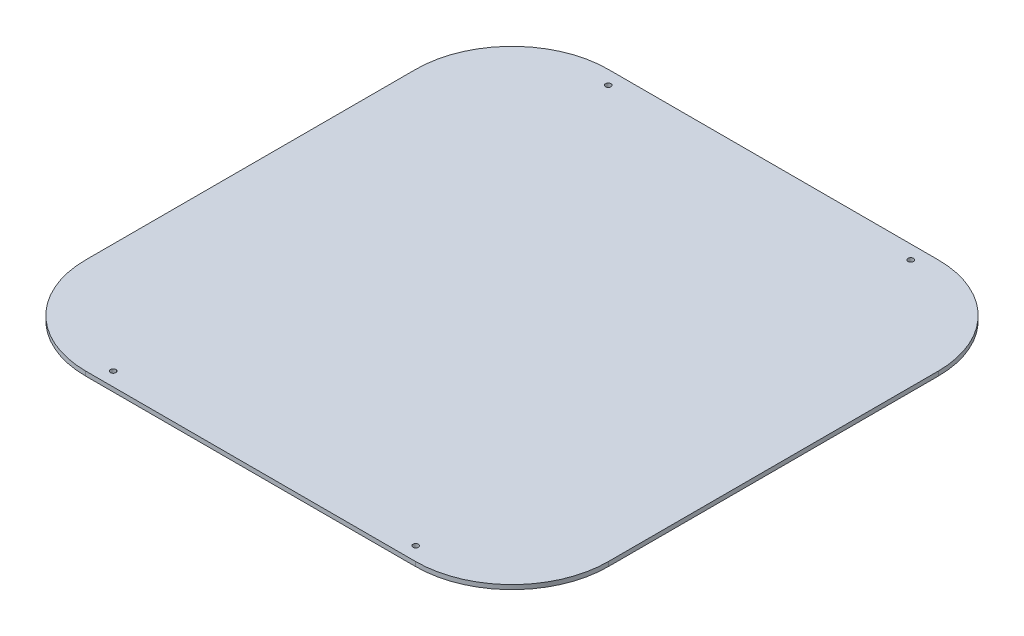
ISO-10303-21;
HEADER;
FILE_DESCRIPTION(('STEP AP214'),'2;1');
FILE_NAME('part.step','',(''),(''),'','','');
FILE_SCHEMA(('AUTOMOTIVE_DESIGN { 1 0 10303 214 1 1 1 1 }'));
ENDSEC;
DATA;
#1=APPLICATION_CONTEXT('core data for automotive mechanical design processes');
#2=APPLICATION_PROTOCOL_DEFINITION('international standard','automotive_design',2000,#1);
#3=PRODUCT_CONTEXT('',#1,'mechanical');
#4=PRODUCT('Part','Part','',(#3));
#5=PRODUCT_RELATED_PRODUCT_CATEGORY('part','',(#4));
#6=PRODUCT_DEFINITION_FORMATION('','',#4);
#7=PRODUCT_DEFINITION_CONTEXT('part definition',#1,'design');
#8=PRODUCT_DEFINITION('design','',#6,#7);
#9=PRODUCT_DEFINITION_SHAPE('','',#8);
#10=(LENGTH_UNIT() NAMED_UNIT(*) SI_UNIT(.MILLI.,.METRE.));
#11=(NAMED_UNIT(*) PLANE_ANGLE_UNIT() SI_UNIT($,.RADIAN.));
#12=(NAMED_UNIT(*) SI_UNIT($,.STERADIAN.) SOLID_ANGLE_UNIT());
#13=UNCERTAINTY_MEASURE_WITH_UNIT(LENGTH_MEASURE(1.E-05),#10,'distance_accuracy_value','');
#14=(GEOMETRIC_REPRESENTATION_CONTEXT(3) GLOBAL_UNCERTAINTY_ASSIGNED_CONTEXT((#13)) GLOBAL_UNIT_ASSIGNED_CONTEXT((#10,
#11,#12)) REPRESENTATION_CONTEXT('',''));
#15=CARTESIAN_POINT('',(0.,0.,0.));
#16=DIRECTION('',(0.,0.,1.));
#17=DIRECTION('',(1.,0.,0.));
#18=AXIS2_PLACEMENT_3D('',#15,#16,#17);
#19=CARTESIAN_POINT('',(95.,1.6,95.));
#20=DIRECTION('',(-1.,0.,0.));
#21=DIRECTION('',(0.,0.,1.));
#22=AXIS2_PLACEMENT_3D('',#19,#20,#21);
#23=PLANE('',#22);
#24=DIRECTION('',(0.,0.,-1.));
#25=VECTOR('',#24,1.);
#26=CARTESIAN_POINT('',(95.,0.,95.));
#27=LINE('',#26,#25);
#28=CARTESIAN_POINT('',(95.,0.,60.));
#29=VERTEX_POINT('',#28);
#30=CARTESIAN_POINT('',(95.,0.,-60.));
#31=VERTEX_POINT('',#30);
#32=EDGE_CURVE('E127',#29,#31,#27,.T.);
#33=ORIENTED_EDGE('',*,*,#32,.T.);
#34=DIRECTION('',(0.,-1.,0.));
#35=VECTOR('',#34,1.);
#36=CARTESIAN_POINT('',(95.,1.6,-60.));
#37=LINE('',#36,#35);
#38=CARTESIAN_POINT('',(95.,1.6,-60.));
#39=VERTEX_POINT('',#38);
#40=EDGE_CURVE('E104',#31,#39,#37,.F.);
#41=ORIENTED_EDGE('',*,*,#40,.T.);
#42=DIRECTION('',(0.,0.,-1.));
#43=VECTOR('',#42,1.);
#44=CARTESIAN_POINT('',(95.,1.6,95.));
#45=LINE('',#44,#43);
#46=CARTESIAN_POINT('',(95.,1.6,60.));
#47=VERTEX_POINT('',#46);
#48=EDGE_CURVE('E137',#47,#39,#45,.T.);
#49=ORIENTED_EDGE('',*,*,#48,.F.);
#50=DIRECTION('',(0.,-1.,0.));
#51=VECTOR('',#50,1.);
#52=CARTESIAN_POINT('',(95.,1.6,60.));
#53=LINE('',#52,#51);
#54=EDGE_CURVE('E109',#47,#29,#53,.T.);
#55=ORIENTED_EDGE('',*,*,#54,.T.);
#56=EDGE_LOOP('',(#33,#41,#49,#55));
#57=FACE_BOUND('',#56,.T.);
#58=ADVANCED_FACE('F32',(#57),#23,.F.);
#59=CARTESIAN_POINT('',(-95.,1.6,-95.));
#60=DIRECTION('',(0.,0.,1.));
#61=DIRECTION('',(1.,0.,0.));
#62=AXIS2_PLACEMENT_3D('',#59,#60,#61);
#63=PLANE('',#62);
#64=DIRECTION('',(-1.,0.,0.));
#65=VECTOR('',#64,1.);
#66=CARTESIAN_POINT('',(-95.,1.6,-95.));
#67=LINE('',#66,#65);
#68=CARTESIAN_POINT('',(60.,1.6,-95.));
#69=VERTEX_POINT('',#68);
#70=CARTESIAN_POINT('',(-60.,1.6,-95.));
#71=VERTEX_POINT('',#70);
#72=EDGE_CURVE('E119',#69,#71,#67,.T.);
#73=ORIENTED_EDGE('',*,*,#72,.F.);
#74=DIRECTION('',(0.,-1.,0.));
#75=VECTOR('',#74,1.);
#76=CARTESIAN_POINT('',(60.,1.6,-95.));
#77=LINE('',#76,#75);
#78=CARTESIAN_POINT('',(60.,0.,-95.));
#79=VERTEX_POINT('',#78);
#80=EDGE_CURVE('E103',#69,#79,#77,.T.);
#81=ORIENTED_EDGE('',*,*,#80,.T.);
#82=DIRECTION('',(-1.,0.,0.));
#83=VECTOR('',#82,1.);
#84=CARTESIAN_POINT('',(-95.,0.,-95.));
#85=LINE('',#84,#83);
#86=CARTESIAN_POINT('',(-60.,0.,-95.));
#87=VERTEX_POINT('',#86);
#88=EDGE_CURVE('E116',#79,#87,#85,.T.);
#89=ORIENTED_EDGE('',*,*,#88,.T.);
#90=DIRECTION('',(0.,-1.,0.));
#91=VECTOR('',#90,1.);
#92=CARTESIAN_POINT('',(-60.,1.6,-95.));
#93=LINE('',#92,#91);
#94=EDGE_CURVE('E121',#87,#71,#93,.F.);
#95=ORIENTED_EDGE('',*,*,#94,.T.);
#96=EDGE_LOOP('',(#73,#81,#89,#95));
#97=FACE_BOUND('',#96,.T.);
#98=ADVANCED_FACE('F115',(#97),#63,.F.);
#99=CARTESIAN_POINT('',(-95.,1.6,95.));
#100=DIRECTION('',(1.,0.,0.));
#101=DIRECTION('',(0.,0.,-1.));
#102=AXIS2_PLACEMENT_3D('',#99,#100,#101);
#103=PLANE('',#102);
#104=DIRECTION('',(0.,0.,1.));
#105=VECTOR('',#104,1.);
#106=CARTESIAN_POINT('',(-95.,1.6,95.));
#107=LINE('',#106,#105);
#108=CARTESIAN_POINT('',(-95.,1.6,-60.));
#109=VERTEX_POINT('',#108);
#110=CARTESIAN_POINT('',(-95.,1.6,60.));
#111=VERTEX_POINT('',#110);
#112=EDGE_CURVE('E160',#109,#111,#107,.T.);
#113=ORIENTED_EDGE('',*,*,#112,.F.);
#114=DIRECTION('',(0.,-1.,0.));
#115=VECTOR('',#114,1.);
#116=CARTESIAN_POINT('',(-95.,1.6,-60.));
#117=LINE('',#116,#115);
#118=CARTESIAN_POINT('',(-95.,0.,-60.));
#119=VERTEX_POINT('',#118);
#120=EDGE_CURVE('E11',#109,#119,#117,.T.);
#121=ORIENTED_EDGE('',*,*,#120,.T.);
#122=DIRECTION('',(0.,0.,1.));
#123=VECTOR('',#122,1.);
#124=CARTESIAN_POINT('',(-95.,0.,95.));
#125=LINE('',#124,#123);
#126=CARTESIAN_POINT('',(-95.,0.,60.));
#127=VERTEX_POINT('',#126);
#128=EDGE_CURVE('E126',#119,#127,#125,.T.);
#129=ORIENTED_EDGE('',*,*,#128,.T.);
#130=DIRECTION('',(0.,-1.,0.));
#131=VECTOR('',#130,1.);
#132=CARTESIAN_POINT('',(-95.,1.6,60.));
#133=LINE('',#132,#131);
#134=EDGE_CURVE('E40',#127,#111,#133,.F.);
#135=ORIENTED_EDGE('',*,*,#134,.T.);
#136=EDGE_LOOP('',(#113,#121,#129,#135));
#137=FACE_BOUND('',#136,.T.);
#138=ADVANCED_FACE('F159',(#137),#103,.F.);
#139=CARTESIAN_POINT('',(-95.,1.6,95.));
#140=DIRECTION('',(0.,0.,-1.));
#141=DIRECTION('',(-1.,0.,0.));
#142=AXIS2_PLACEMENT_3D('',#139,#140,#141);
#143=PLANE('',#142);
#144=DIRECTION('',(1.,0.,0.));
#145=VECTOR('',#144,1.);
#146=CARTESIAN_POINT('',(-95.,0.,95.));
#147=LINE('',#146,#145);
#148=CARTESIAN_POINT('',(-60.,0.,95.));
#149=VERTEX_POINT('',#148);
#150=CARTESIAN_POINT('',(60.,0.,95.));
#151=VERTEX_POINT('',#150);
#152=EDGE_CURVE('E130',#149,#151,#147,.T.);
#153=ORIENTED_EDGE('',*,*,#152,.T.);
#154=DIRECTION('',(0.,-1.,0.));
#155=VECTOR('',#154,1.);
#156=CARTESIAN_POINT('',(60.,1.6,95.));
#157=LINE('',#156,#155);
#158=CARTESIAN_POINT('',(60.,1.6,95.));
#159=VERTEX_POINT('',#158);
#160=EDGE_CURVE('E47',#151,#159,#157,.F.);
#161=ORIENTED_EDGE('',*,*,#160,.T.);
#162=DIRECTION('',(1.,0.,0.));
#163=VECTOR('',#162,1.);
#164=CARTESIAN_POINT('',(-95.,1.6,95.));
#165=LINE('',#164,#163);
#166=CARTESIAN_POINT('',(-60.,1.6,95.));
#167=VERTEX_POINT('',#166);
#168=EDGE_CURVE('E138',#167,#159,#165,.T.);
#169=ORIENTED_EDGE('',*,*,#168,.F.);
#170=DIRECTION('',(0.,-1.,0.));
#171=VECTOR('',#170,1.);
#172=CARTESIAN_POINT('',(-60.,1.6,95.));
#173=LINE('',#172,#171);
#174=EDGE_CURVE('E153',#167,#149,#173,.T.);
#175=ORIENTED_EDGE('',*,*,#174,.T.);
#176=EDGE_LOOP('',(#153,#161,#169,#175));
#177=FACE_BOUND('',#176,.T.);
#178=ADVANCED_FACE('F169',(#177),#143,.F.);
#179=CARTESIAN_POINT('',(0.,1.6,0.));
#180=DIRECTION('',(0.,-1.,0.));
#181=DIRECTION('',(0.,0.,-1.));
#182=AXIS2_PLACEMENT_3D('',#179,#180,#181);
#183=PLANE('',#182);
#184=CARTESIAN_POINT('',(-55.,1.6,90.));
#185=DIRECTION('',(0.,1.,0.));
#186=DIRECTION('',(0.,0.,-1.));
#187=AXIS2_PLACEMENT_3D('',#184,#185,#186);
#188=CIRCLE('',#187,0.999999999999998);
#189=CARTESIAN_POINT('',(-55.,1.6,89.));
#190=VERTEX_POINT('',#189);
#191=EDGE_CURVE('E197',#190,#190,#188,.T.);
#192=ORIENTED_EDGE('',*,*,#191,.F.);
#193=EDGE_LOOP('',(#192));
#194=FACE_BOUND('',#193,.T.);
#195=CARTESIAN_POINT('',(55.,1.6,90.));
#196=DIRECTION('',(0.,1.,0.));
#197=DIRECTION('',(0.,0.,1.));
#198=AXIS2_PLACEMENT_3D('',#195,#196,#197);
#199=CIRCLE('',#198,0.999999999999998);
#200=CARTESIAN_POINT('',(55.,1.6,91.));
#201=VERTEX_POINT('',#200);
#202=EDGE_CURVE('E191',#201,#201,#199,.T.);
#203=ORIENTED_EDGE('',*,*,#202,.F.);
#204=EDGE_LOOP('',(#203));
#205=FACE_BOUND('',#204,.T.);
#206=CARTESIAN_POINT('',(55.,1.6,-90.));
#207=DIRECTION('',(0.,1.,0.));
#208=DIRECTION('',(0.,0.,-1.));
#209=AXIS2_PLACEMENT_3D('',#206,#207,#208);
#210=CIRCLE('',#209,0.999999999999998);
#211=CARTESIAN_POINT('',(55.,1.6,-91.));
#212=VERTEX_POINT('',#211);
#213=EDGE_CURVE('E185',#212,#212,#210,.T.);
#214=ORIENTED_EDGE('',*,*,#213,.F.);
#215=EDGE_LOOP('',(#214));
#216=FACE_BOUND('',#215,.T.);
#217=CARTESIAN_POINT('',(-55.,1.6,-90.));
#218=DIRECTION('',(0.,1.,0.));
#219=DIRECTION('',(0.,0.,1.));
#220=AXIS2_PLACEMENT_3D('',#217,#218,#219);
#221=CIRCLE('',#220,0.999999999999998);
#222=CARTESIAN_POINT('',(-55.,1.6,-89.));
#223=VERTEX_POINT('',#222);
#224=EDGE_CURVE('E179',#223,#223,#221,.T.);
#225=ORIENTED_EDGE('',*,*,#224,.F.);
#226=EDGE_LOOP('',(#225));
#227=FACE_BOUND('',#226,.T.);
#228=ORIENTED_EDGE('',*,*,#48,.T.);
#229=CARTESIAN_POINT('',(60.,1.6,-60.));
#230=DIRECTION('',(0.,-1.,0.));
#231=DIRECTION('',(0.,0.,-1.));
#232=AXIS2_PLACEMENT_3D('',#229,#230,#231);
#233=CIRCLE('',#232,35.);
#234=EDGE_CURVE('E151',#39,#69,#233,.F.);
#235=ORIENTED_EDGE('',*,*,#234,.T.);
#236=ORIENTED_EDGE('',*,*,#72,.T.);
#237=CARTESIAN_POINT('',(-60.,1.6,-60.));
#238=DIRECTION('',(0.,-1.,0.));
#239=DIRECTION('',(0.,0.,-1.));
#240=AXIS2_PLACEMENT_3D('',#237,#238,#239);
#241=CIRCLE('',#240,35.);
#242=EDGE_CURVE('E147',#71,#109,#241,.F.);
#243=ORIENTED_EDGE('',*,*,#242,.T.);
#244=ORIENTED_EDGE('',*,*,#112,.T.);
#245=CARTESIAN_POINT('',(-60.,1.6,60.));
#246=DIRECTION('',(0.,-1.,0.));
#247=DIRECTION('',(0.,0.,-1.));
#248=AXIS2_PLACEMENT_3D('',#245,#246,#247);
#249=CIRCLE('',#248,35.);
#250=EDGE_CURVE('E54',#111,#167,#249,.F.);
#251=ORIENTED_EDGE('',*,*,#250,.T.);
#252=ORIENTED_EDGE('',*,*,#168,.T.);
#253=CARTESIAN_POINT('',(60.,1.6,60.));
#254=DIRECTION('',(0.,-1.,0.));
#255=DIRECTION('',(0.,0.,-1.));
#256=AXIS2_PLACEMENT_3D('',#253,#254,#255);
#257=CIRCLE('',#256,35.);
#258=EDGE_CURVE('E149',#159,#47,#257,.F.);
#259=ORIENTED_EDGE('',*,*,#258,.T.);
#260=EDGE_LOOP('',(#228,#235,#236,#243,#244,#251,#252,#259));
#261=FACE_BOUND('',#260,.T.);
#262=ADVANCED_FACE('F164',(#194,#205,#216,#227,#261),#183,.F.);
#263=CARTESIAN_POINT('',(0.,0.,0.));
#264=DIRECTION('',(0.,-1.,0.));
#265=DIRECTION('',(0.,0.,-1.));
#266=AXIS2_PLACEMENT_3D('',#263,#264,#265);
#267=PLANE('',#266);
#268=CARTESIAN_POINT('',(-55.,0.,90.));
#269=DIRECTION('',(0.,1.,0.));
#270=DIRECTION('',(0.,0.,-1.));
#271=AXIS2_PLACEMENT_3D('',#268,#269,#270);
#272=CIRCLE('',#271,0.999999999999998);
#273=CARTESIAN_POINT('',(-55.,0.,89.));
#274=VERTEX_POINT('',#273);
#275=EDGE_CURVE('E194',#274,#274,#272,.T.);
#276=ORIENTED_EDGE('',*,*,#275,.T.);
#277=EDGE_LOOP('',(#276));
#278=FACE_BOUND('',#277,.T.);
#279=CARTESIAN_POINT('',(55.,0.,90.));
#280=DIRECTION('',(0.,1.,0.));
#281=DIRECTION('',(0.,0.,1.));
#282=AXIS2_PLACEMENT_3D('',#279,#280,#281);
#283=CIRCLE('',#282,0.999999999999998);
#284=CARTESIAN_POINT('',(55.,0.,91.));
#285=VERTEX_POINT('',#284);
#286=EDGE_CURVE('E188',#285,#285,#283,.T.);
#287=ORIENTED_EDGE('',*,*,#286,.T.);
#288=EDGE_LOOP('',(#287));
#289=FACE_BOUND('',#288,.T.);
#290=CARTESIAN_POINT('',(55.,0.,-90.));
#291=DIRECTION('',(0.,1.,0.));
#292=DIRECTION('',(0.,0.,-1.));
#293=AXIS2_PLACEMENT_3D('',#290,#291,#292);
#294=CIRCLE('',#293,0.999999999999998);
#295=CARTESIAN_POINT('',(55.,0.,-91.));
#296=VERTEX_POINT('',#295);
#297=EDGE_CURVE('E182',#296,#296,#294,.T.);
#298=ORIENTED_EDGE('',*,*,#297,.T.);
#299=EDGE_LOOP('',(#298));
#300=FACE_BOUND('',#299,.T.);
#301=CARTESIAN_POINT('',(-55.,0.,-90.));
#302=DIRECTION('',(0.,1.,0.));
#303=DIRECTION('',(0.,0.,1.));
#304=AXIS2_PLACEMENT_3D('',#301,#302,#303);
#305=CIRCLE('',#304,0.999999999999998);
#306=CARTESIAN_POINT('',(-55.,0.,-89.));
#307=VERTEX_POINT('',#306);
#308=EDGE_CURVE('E132',#307,#307,#305,.T.);
#309=ORIENTED_EDGE('',*,*,#308,.T.);
#310=EDGE_LOOP('',(#309));
#311=FACE_BOUND('',#310,.T.);
#312=ORIENTED_EDGE('',*,*,#88,.F.);
#313=CARTESIAN_POINT('',(60.,0.,-60.));
#314=DIRECTION('',(0.,-1.,0.));
#315=DIRECTION('',(0.,0.,-1.));
#316=AXIS2_PLACEMENT_3D('',#313,#314,#315);
#317=CIRCLE('',#316,35.);
#318=EDGE_CURVE('E99',#79,#31,#317,.T.);
#319=ORIENTED_EDGE('',*,*,#318,.T.);
#320=ORIENTED_EDGE('',*,*,#32,.F.);
#321=CARTESIAN_POINT('',(60.,0.,60.));
#322=DIRECTION('',(0.,-1.,0.));
#323=DIRECTION('',(0.,0.,-1.));
#324=AXIS2_PLACEMENT_3D('',#321,#322,#323);
#325=CIRCLE('',#324,35.);
#326=EDGE_CURVE('E110',#29,#151,#325,.T.);
#327=ORIENTED_EDGE('',*,*,#326,.T.);
#328=ORIENTED_EDGE('',*,*,#152,.F.);
#329=CARTESIAN_POINT('',(-60.,0.,60.));
#330=DIRECTION('',(0.,-1.,0.));
#331=DIRECTION('',(0.,0.,-1.));
#332=AXIS2_PLACEMENT_3D('',#329,#330,#331);
#333=CIRCLE('',#332,35.);
#334=EDGE_CURVE('E120',#149,#127,#333,.T.);
#335=ORIENTED_EDGE('',*,*,#334,.T.);
#336=ORIENTED_EDGE('',*,*,#128,.F.);
#337=CARTESIAN_POINT('',(-60.,0.,-60.));
#338=DIRECTION('',(0.,-1.,0.));
#339=DIRECTION('',(0.,0.,-1.));
#340=AXIS2_PLACEMENT_3D('',#337,#338,#339);
#341=CIRCLE('',#340,35.);
#342=EDGE_CURVE('E125',#119,#87,#341,.T.);
#343=ORIENTED_EDGE('',*,*,#342,.T.);
#344=EDGE_LOOP('',(#312,#319,#320,#327,#328,#335,#336,#343));
#345=FACE_BOUND('',#344,.T.);
#346=ADVANCED_FACE('F123',(#278,#289,#300,#311,#345),#267,.T.);
#347=CARTESIAN_POINT('',(60.,1.6,-60.));
#348=DIRECTION('',(0.,-1.,0.));
#349=DIRECTION('',(0.,0.,-1.));
#350=AXIS2_PLACEMENT_3D('',#347,#348,#349);
#351=CYLINDRICAL_SURFACE('',#350,35.);
#352=ORIENTED_EDGE('',*,*,#234,.F.);
#353=ORIENTED_EDGE('',*,*,#40,.F.);
#354=ORIENTED_EDGE('',*,*,#318,.F.);
#355=ORIENTED_EDGE('',*,*,#80,.F.);
#356=EDGE_LOOP('',(#352,#353,#354,#355));
#357=FACE_BOUND('',#356,.T.);
#358=ADVANCED_FACE('F102',(#357),#351,.T.);
#359=CARTESIAN_POINT('',(60.,1.6,60.));
#360=DIRECTION('',(0.,-1.,0.));
#361=DIRECTION('',(0.,0.,-1.));
#362=AXIS2_PLACEMENT_3D('',#359,#360,#361);
#363=CYLINDRICAL_SURFACE('',#362,35.);
#364=ORIENTED_EDGE('',*,*,#258,.F.);
#365=ORIENTED_EDGE('',*,*,#160,.F.);
#366=ORIENTED_EDGE('',*,*,#326,.F.);
#367=ORIENTED_EDGE('',*,*,#54,.F.);
#368=EDGE_LOOP('',(#364,#365,#366,#367));
#369=FACE_BOUND('',#368,.T.);
#370=ADVANCED_FACE('F173',(#369),#363,.T.);
#371=CARTESIAN_POINT('',(-60.,1.6,-60.));
#372=DIRECTION('',(0.,-1.,0.));
#373=DIRECTION('',(0.,0.,-1.));
#374=AXIS2_PLACEMENT_3D('',#371,#372,#373);
#375=CYLINDRICAL_SURFACE('',#374,35.);
#376=ORIENTED_EDGE('',*,*,#242,.F.);
#377=ORIENTED_EDGE('',*,*,#94,.F.);
#378=ORIENTED_EDGE('',*,*,#342,.F.);
#379=ORIENTED_EDGE('',*,*,#120,.F.);
#380=EDGE_LOOP('',(#376,#377,#378,#379));
#381=FACE_BOUND('',#380,.T.);
#382=ADVANCED_FACE('F232',(#381),#375,.T.);
#383=CARTESIAN_POINT('',(-60.,1.6,60.));
#384=DIRECTION('',(0.,-1.,0.));
#385=DIRECTION('',(0.,0.,-1.));
#386=AXIS2_PLACEMENT_3D('',#383,#384,#385);
#387=CYLINDRICAL_SURFACE('',#386,35.);
#388=ORIENTED_EDGE('',*,*,#250,.F.);
#389=ORIENTED_EDGE('',*,*,#134,.F.);
#390=ORIENTED_EDGE('',*,*,#334,.F.);
#391=ORIENTED_EDGE('',*,*,#174,.F.);
#392=EDGE_LOOP('',(#388,#389,#390,#391));
#393=FACE_BOUND('',#392,.T.);
#394=ADVANCED_FACE('F34',(#393),#387,.T.);
#395=CARTESIAN_POINT('',(-55.,0.,-90.));
#396=DIRECTION('',(0.,1.,0.));
#397=DIRECTION('',(0.,0.,1.));
#398=AXIS2_PLACEMENT_3D('',#395,#396,#397);
#399=CYLINDRICAL_SURFACE('',#398,0.999999999999998);
#400=ORIENTED_EDGE('',*,*,#308,.F.);
#401=EDGE_LOOP('',(#400));
#402=FACE_BOUND('',#401,.T.);
#403=ORIENTED_EDGE('',*,*,#224,.T.);
#404=EDGE_LOOP('',(#403));
#405=FACE_BOUND('',#404,.T.);
#406=ADVANCED_FACE('F221',(#402,#405),#399,.F.);
#407=CARTESIAN_POINT('',(55.,0.,-90.));
#408=DIRECTION('',(0.,1.,0.));
#409=DIRECTION('',(0.,0.,1.));
#410=AXIS2_PLACEMENT_3D('',#407,#408,#409);
#411=CYLINDRICAL_SURFACE('',#410,0.999999999999998);
#412=ORIENTED_EDGE('',*,*,#297,.F.);
#413=EDGE_LOOP('',(#412));
#414=FACE_BOUND('',#413,.T.);
#415=ORIENTED_EDGE('',*,*,#213,.T.);
#416=EDGE_LOOP('',(#415));
#417=FACE_BOUND('',#416,.T.);
#418=ADVANCED_FACE('F223',(#414,#417),#411,.F.);
#419=CARTESIAN_POINT('',(55.,0.,90.));
#420=DIRECTION('',(0.,1.,0.));
#421=DIRECTION('',(0.,0.,1.));
#422=AXIS2_PLACEMENT_3D('',#419,#420,#421);
#423=CYLINDRICAL_SURFACE('',#422,0.999999999999998);
#424=ORIENTED_EDGE('',*,*,#286,.F.);
#425=EDGE_LOOP('',(#424));
#426=FACE_BOUND('',#425,.T.);
#427=ORIENTED_EDGE('',*,*,#202,.T.);
#428=EDGE_LOOP('',(#427));
#429=FACE_BOUND('',#428,.T.);
#430=ADVANCED_FACE('F208',(#426,#429),#423,.F.);
#431=CARTESIAN_POINT('',(-55.,0.,90.));
#432=DIRECTION('',(0.,1.,0.));
#433=DIRECTION('',(0.,0.,1.));
#434=AXIS2_PLACEMENT_3D('',#431,#432,#433);
#435=CYLINDRICAL_SURFACE('',#434,0.999999999999998);
#436=ORIENTED_EDGE('',*,*,#275,.F.);
#437=EDGE_LOOP('',(#436));
#438=FACE_BOUND('',#437,.T.);
#439=ORIENTED_EDGE('',*,*,#191,.T.);
#440=EDGE_LOOP('',(#439));
#441=FACE_BOUND('',#440,.T.);
#442=ADVANCED_FACE('F205',(#438,#441),#435,.F.);
#443=CLOSED_SHELL('',(#58,#98,#138,#178,#262,#346,#358,#370,#382,#394,#406,#418,#430,#442));
#444=MANIFOLD_SOLID_BREP('B2',#443);
#445=ADVANCED_BREP_SHAPE_REPRESENTATION('',(#18,#444),#14);
#446=SHAPE_DEFINITION_REPRESENTATION(#9,#445);
ENDSEC;
END-ISO-10303-21;
